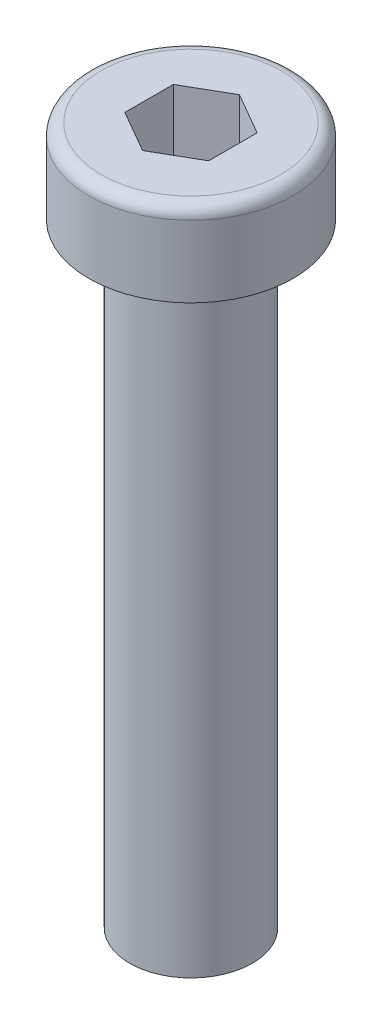
ISO-10303-21;
HEADER;
FILE_DESCRIPTION(('STEP AP214'),'2;1');
FILE_NAME('part.step','',(''),(''),'','','');
FILE_SCHEMA(('AUTOMOTIVE_DESIGN { 1 0 10303 214 1 1 1 1 }'));
ENDSEC;
DATA;
#1=APPLICATION_CONTEXT('core data for automotive mechanical design processes');
#2=APPLICATION_PROTOCOL_DEFINITION('international standard','automotive_design',2000,#1);
#3=PRODUCT_CONTEXT('',#1,'mechanical');
#4=PRODUCT('Part','Part','',(#3));
#5=PRODUCT_RELATED_PRODUCT_CATEGORY('part','',(#4));
#6=PRODUCT_DEFINITION_FORMATION('','',#4);
#7=PRODUCT_DEFINITION_CONTEXT('part definition',#1,'design');
#8=PRODUCT_DEFINITION('design','',#6,#7);
#9=PRODUCT_DEFINITION_SHAPE('','',#8);
#10=(LENGTH_UNIT() NAMED_UNIT(*) SI_UNIT(.MILLI.,.METRE.));
#11=(NAMED_UNIT(*) PLANE_ANGLE_UNIT() SI_UNIT($,.RADIAN.));
#12=(NAMED_UNIT(*) SI_UNIT($,.STERADIAN.) SOLID_ANGLE_UNIT());
#13=UNCERTAINTY_MEASURE_WITH_UNIT(LENGTH_MEASURE(1.E-05),#10,'distance_accuracy_value','');
#14=(GEOMETRIC_REPRESENTATION_CONTEXT(3) GLOBAL_UNCERTAINTY_ASSIGNED_CONTEXT((#13)) GLOBAL_UNIT_ASSIGNED_CONTEXT((#10,
#11,#12)) REPRESENTATION_CONTEXT('',''));
#15=CARTESIAN_POINT('',(0.,0.,0.));
#16=DIRECTION('',(0.,0.,1.));
#17=DIRECTION('',(1.,0.,0.));
#18=AXIS2_PLACEMENT_3D('',#15,#16,#17);
#19=CARTESIAN_POINT('',(0.,4.1,0.));
#20=DIRECTION('',(0.,-1.,0.));
#21=DIRECTION('',(0.,0.,-1.));
#22=AXIS2_PLACEMENT_3D('',#19,#20,#21);
#23=CYLINDRICAL_SURFACE('',#22,5.);
#24=CARTESIAN_POINT('',(0.,3.5,0.));
#25=DIRECTION('',(0.,1.,0.));
#26=DIRECTION('',(0.,0.,1.));
#27=AXIS2_PLACEMENT_3D('',#24,#25,#26);
#28=CIRCLE('',#27,5.);
#29=CARTESIAN_POINT('',(0.,3.5,5.));
#30=VERTEX_POINT('',#29);
#31=EDGE_CURVE('E37',#30,#30,#28,.F.);
#32=ORIENTED_EDGE('',*,*,#31,.T.);
#33=EDGE_LOOP('',(#32));
#34=FACE_BOUND('',#33,.T.);
#35=CARTESIAN_POINT('',(0.,0.,0.));
#36=DIRECTION('',(0.,1.,0.));
#37=DIRECTION('',(0.,0.,1.));
#38=AXIS2_PLACEMENT_3D('',#35,#36,#37);
#39=CIRCLE('',#38,5.);
#40=CARTESIAN_POINT('',(0.,0.,5.));
#41=VERTEX_POINT('',#40);
#42=EDGE_CURVE('E137',#41,#41,#39,.T.);
#43=ORIENTED_EDGE('',*,*,#42,.T.);
#44=EDGE_LOOP('',(#43));
#45=FACE_BOUND('',#44,.T.);
#46=ADVANCED_FACE('F33',(#34,#45),#23,.T.);
#47=CARTESIAN_POINT('',(0.,4.1,0.));
#48=DIRECTION('',(0.,1.,0.));
#49=DIRECTION('',(0.,0.,1.));
#50=AXIS2_PLACEMENT_3D('',#47,#48,#49);
#51=PLANE('',#50);
#52=DIRECTION('',(0.866025403784439,0.,0.5));
#53=VECTOR('',#52,1.);
#54=CARTESIAN_POINT('',(-2.05,4.1,1.18356805183873));
#55=LINE('',#54,#53);
#56=CARTESIAN_POINT('',(-2.05,4.1,1.18356805183873));
#57=VERTEX_POINT('',#56);
#58=CARTESIAN_POINT('',(0.,4.1,2.36713610367747));
#59=VERTEX_POINT('',#58);
#60=EDGE_CURVE('E49',#57,#59,#55,.T.);
#61=ORIENTED_EDGE('',*,*,#60,.F.);
#62=DIRECTION('',(0.,0.,1.));
#63=VECTOR('',#62,1.);
#64=CARTESIAN_POINT('',(-2.05,4.1,-1.18356805183873));
#65=LINE('',#64,#63);
#66=CARTESIAN_POINT('',(-2.05,4.1,-1.18356805183873));
#67=VERTEX_POINT('',#66);
#68=EDGE_CURVE('E133',#67,#57,#65,.T.);
#69=ORIENTED_EDGE('',*,*,#68,.F.);
#70=DIRECTION('',(-0.866025403784438,0.,0.5));
#71=VECTOR('',#70,1.);
#72=CARTESIAN_POINT('',(0.,4.1,-2.36713610367747));
#73=LINE('',#72,#71);
#74=CARTESIAN_POINT('',(0.,4.1,-2.36713610367747));
#75=VERTEX_POINT('',#74);
#76=EDGE_CURVE('E131',#75,#67,#73,.T.);
#77=ORIENTED_EDGE('',*,*,#76,.F.);
#78=DIRECTION('',(-0.866025403784439,0.,-0.5));
#79=VECTOR('',#78,1.);
#80=CARTESIAN_POINT('',(2.05,4.1,-1.18356805183873));
#81=LINE('',#80,#79);
#82=CARTESIAN_POINT('',(2.05,4.1,-1.18356805183873));
#83=VERTEX_POINT('',#82);
#84=EDGE_CURVE('E97',#83,#75,#81,.T.);
#85=ORIENTED_EDGE('',*,*,#84,.F.);
#86=DIRECTION('',(0.,0.,-1.));
#87=VECTOR('',#86,1.);
#88=CARTESIAN_POINT('',(2.05,4.1,1.18356805183873));
#89=LINE('',#88,#87);
#90=CARTESIAN_POINT('',(2.05,4.1,1.18356805183873));
#91=VERTEX_POINT('',#90);
#92=EDGE_CURVE('E127',#91,#83,#89,.T.);
#93=ORIENTED_EDGE('',*,*,#92,.F.);
#94=DIRECTION('',(0.866025403784438,0.,-0.5));
#95=VECTOR('',#94,1.);
#96=CARTESIAN_POINT('',(0.,4.1,2.36713610367747));
#97=LINE('',#96,#95);
#98=EDGE_CURVE('E123',#59,#91,#97,.T.);
#99=ORIENTED_EDGE('',*,*,#98,.F.);
#100=EDGE_LOOP('',(#61,#69,#77,#85,#93,#99));
#101=FACE_BOUND('',#100,.T.);
#102=CARTESIAN_POINT('',(0.,4.1,0.));
#103=DIRECTION('',(0.,1.,0.));
#104=DIRECTION('',(0.,0.,1.));
#105=AXIS2_PLACEMENT_3D('',#102,#103,#104);
#106=CIRCLE('',#105,4.4);
#107=CARTESIAN_POINT('',(0.,4.1,4.4));
#108=VERTEX_POINT('',#107);
#109=EDGE_CURVE('E144',#108,#108,#106,.T.);
#110=ORIENTED_EDGE('',*,*,#109,.T.);
#111=EDGE_LOOP('',(#110));
#112=FACE_BOUND('',#111,.T.);
#113=ADVANCED_FACE('F163',(#101,#112),#51,.T.);
#114=CARTESIAN_POINT('',(0.,0.,0.));
#115=DIRECTION('',(0.,1.,0.));
#116=DIRECTION('',(0.,0.,1.));
#117=AXIS2_PLACEMENT_3D('',#114,#115,#116);
#118=PLANE('',#117);
#119=CARTESIAN_POINT('',(0.,0.,0.));
#120=DIRECTION('',(0.,-1.,0.));
#121=DIRECTION('',(0.,0.,-1.));
#122=AXIS2_PLACEMENT_3D('',#119,#120,#121);
#123=CIRCLE('',#122,3.);
#124=CARTESIAN_POINT('',(0.,0.,-3.));
#125=VERTEX_POINT('',#124);
#126=EDGE_CURVE('E11',#125,#125,#123,.T.);
#127=ORIENTED_EDGE('',*,*,#126,.F.);
#128=EDGE_LOOP('',(#127));
#129=FACE_BOUND('',#128,.T.);
#130=ORIENTED_EDGE('',*,*,#42,.F.);
#131=EDGE_LOOP('',(#130));
#132=FACE_BOUND('',#131,.T.);
#133=ADVANCED_FACE('F156',(#129,#132),#118,.F.);
#134=CARTESIAN_POINT('',(0.,3.5,0.));
#135=DIRECTION('',(0.,1.,0.));
#136=DIRECTION('',(0.,0.,1.));
#137=AXIS2_PLACEMENT_3D('',#134,#135,#136);
#138=TOROIDAL_SURFACE('',#137,4.4,0.6);
#139=ORIENTED_EDGE('',*,*,#31,.F.);
#140=EDGE_LOOP('',(#139));
#141=FACE_BOUND('',#140,.T.);
#142=ORIENTED_EDGE('',*,*,#109,.F.);
#143=EDGE_LOOP('',(#142));
#144=FACE_BOUND('',#143,.T.);
#145=ADVANCED_FACE('F35',(#141,#144),#138,.T.);
#146=CARTESIAN_POINT('',(-2.05,0.5,1.18356805183873));
#147=DIRECTION('',(-0.5,0.,0.866025403784438));
#148=DIRECTION('',(0.866025403784439,0.,0.5));
#149=AXIS2_PLACEMENT_3D('',#146,#147,#148);
#150=PLANE('',#149);
#151=ORIENTED_EDGE('',*,*,#60,.T.);
#152=DIRECTION('',(0.,1.,0.));
#153=VECTOR('',#152,1.);
#154=CARTESIAN_POINT('',(0.,0.5,2.36713610367747));
#155=LINE('',#154,#153);
#156=CARTESIAN_POINT('',(0.,0.5,2.36713610367747));
#157=VERTEX_POINT('',#156);
#158=EDGE_CURVE('E79',#157,#59,#155,.T.);
#159=ORIENTED_EDGE('',*,*,#158,.F.);
#160=DIRECTION('',(0.866025403784439,0.,0.5));
#161=VECTOR('',#160,1.);
#162=CARTESIAN_POINT('',(-2.05,0.5,1.18356805183873));
#163=LINE('',#162,#161);
#164=CARTESIAN_POINT('',(-2.05,0.5,1.18356805183873));
#165=VERTEX_POINT('',#164);
#166=EDGE_CURVE('E135',#165,#157,#163,.T.);
#167=ORIENTED_EDGE('',*,*,#166,.F.);
#168=DIRECTION('',(0.,1.,0.));
#169=VECTOR('',#168,1.);
#170=CARTESIAN_POINT('',(-2.05,0.5,1.18356805183873));
#171=LINE('',#170,#169);
#172=EDGE_CURVE('E57',#165,#57,#171,.T.);
#173=ORIENTED_EDGE('',*,*,#172,.T.);
#174=EDGE_LOOP('',(#151,#159,#167,#173));
#175=FACE_BOUND('',#174,.T.);
#176=ADVANCED_FACE('F155',(#175),#150,.F.);
#177=CARTESIAN_POINT('',(-2.05,0.5,-1.18356805183873));
#178=DIRECTION('',(-1.,0.,0.));
#179=DIRECTION('',(0.,0.,1.));
#180=AXIS2_PLACEMENT_3D('',#177,#178,#179);
#181=PLANE('',#180);
#182=ORIENTED_EDGE('',*,*,#68,.T.);
#183=ORIENTED_EDGE('',*,*,#172,.F.);
#184=DIRECTION('',(0.,0.,1.));
#185=VECTOR('',#184,1.);
#186=CARTESIAN_POINT('',(-2.05,0.5,-1.18356805183873));
#187=LINE('',#186,#185);
#188=CARTESIAN_POINT('',(-2.05,0.5,-1.18356805183873));
#189=VERTEX_POINT('',#188);
#190=EDGE_CURVE('E109',#189,#165,#187,.T.);
#191=ORIENTED_EDGE('',*,*,#190,.F.);
#192=DIRECTION('',(0.,1.,0.));
#193=VECTOR('',#192,1.);
#194=CARTESIAN_POINT('',(-2.05,0.5,-1.18356805183873));
#195=LINE('',#194,#193);
#196=EDGE_CURVE('E101',#189,#67,#195,.T.);
#197=ORIENTED_EDGE('',*,*,#196,.T.);
#198=EDGE_LOOP('',(#182,#183,#191,#197));
#199=FACE_BOUND('',#198,.T.);
#200=ADVANCED_FACE('F161',(#199),#181,.F.);
#201=CARTESIAN_POINT('',(0.,0.5,-2.36713610367747));
#202=DIRECTION('',(-0.5,0.,-0.866025403784439));
#203=DIRECTION('',(-0.866025403784439,0.,0.5));
#204=AXIS2_PLACEMENT_3D('',#201,#202,#203);
#205=PLANE('',#204);
#206=ORIENTED_EDGE('',*,*,#76,.T.);
#207=ORIENTED_EDGE('',*,*,#196,.F.);
#208=DIRECTION('',(-0.866025403784438,0.,0.5));
#209=VECTOR('',#208,1.);
#210=CARTESIAN_POINT('',(0.,0.5,-2.36713610367747));
#211=LINE('',#210,#209);
#212=CARTESIAN_POINT('',(0.,0.5,-2.36713610367747));
#213=VERTEX_POINT('',#212);
#214=EDGE_CURVE('E105',#213,#189,#211,.T.);
#215=ORIENTED_EDGE('',*,*,#214,.F.);
#216=DIRECTION('',(0.,1.,0.));
#217=VECTOR('',#216,1.);
#218=CARTESIAN_POINT('',(0.,0.5,-2.36713610367747));
#219=LINE('',#218,#217);
#220=EDGE_CURVE('E90',#213,#75,#219,.T.);
#221=ORIENTED_EDGE('',*,*,#220,.T.);
#222=EDGE_LOOP('',(#206,#207,#215,#221));
#223=FACE_BOUND('',#222,.T.);
#224=ADVANCED_FACE('F106',(#223),#205,.F.);
#225=CARTESIAN_POINT('',(2.05,0.5,-1.18356805183873));
#226=DIRECTION('',(0.5,0.,-0.866025403784439));
#227=DIRECTION('',(-0.866025403784439,0.,-0.5));
#228=AXIS2_PLACEMENT_3D('',#225,#226,#227);
#229=PLANE('',#228);
#230=ORIENTED_EDGE('',*,*,#84,.T.);
#231=ORIENTED_EDGE('',*,*,#220,.F.);
#232=DIRECTION('',(-0.866025403784439,0.,-0.5));
#233=VECTOR('',#232,1.);
#234=CARTESIAN_POINT('',(2.05,0.5,-1.18356805183873));
#235=LINE('',#234,#233);
#236=CARTESIAN_POINT('',(2.05,0.5,-1.18356805183873));
#237=VERTEX_POINT('',#236);
#238=EDGE_CURVE('E94',#237,#213,#235,.T.);
#239=ORIENTED_EDGE('',*,*,#238,.F.);
#240=DIRECTION('',(0.,1.,0.));
#241=VECTOR('',#240,1.);
#242=CARTESIAN_POINT('',(2.05,0.5,-1.18356805183873));
#243=LINE('',#242,#241);
#244=EDGE_CURVE('E102',#237,#83,#243,.T.);
#245=ORIENTED_EDGE('',*,*,#244,.T.);
#246=EDGE_LOOP('',(#230,#231,#239,#245));
#247=FACE_BOUND('',#246,.T.);
#248=ADVANCED_FACE('F92',(#247),#229,.F.);
#249=CARTESIAN_POINT('',(2.05,0.5,1.18356805183873));
#250=DIRECTION('',(1.,0.,0.));
#251=DIRECTION('',(0.,0.,-1.));
#252=AXIS2_PLACEMENT_3D('',#249,#250,#251);
#253=PLANE('',#252);
#254=ORIENTED_EDGE('',*,*,#92,.T.);
#255=ORIENTED_EDGE('',*,*,#244,.F.);
#256=DIRECTION('',(0.,0.,-1.));
#257=VECTOR('',#256,1.);
#258=CARTESIAN_POINT('',(2.05,0.5,1.18356805183873));
#259=LINE('',#258,#257);
#260=CARTESIAN_POINT('',(2.05,0.5,1.18356805183873));
#261=VERTEX_POINT('',#260);
#262=EDGE_CURVE('E115',#261,#237,#259,.T.);
#263=ORIENTED_EDGE('',*,*,#262,.F.);
#264=DIRECTION('',(0.,1.,0.));
#265=VECTOR('',#264,1.);
#266=CARTESIAN_POINT('',(2.05,0.5,1.18356805183873));
#267=LINE('',#266,#265);
#268=EDGE_CURVE('E140',#261,#91,#267,.T.);
#269=ORIENTED_EDGE('',*,*,#268,.T.);
#270=EDGE_LOOP('',(#254,#255,#263,#269));
#271=FACE_BOUND('',#270,.T.);
#272=ADVANCED_FACE('F176',(#271),#253,.F.);
#273=CARTESIAN_POINT('',(0.,0.5,2.36713610367747));
#274=DIRECTION('',(0.5,0.,0.866025403784439));
#275=DIRECTION('',(0.866025403784439,0.,-0.5));
#276=AXIS2_PLACEMENT_3D('',#273,#274,#275);
#277=PLANE('',#276);
#278=ORIENTED_EDGE('',*,*,#98,.T.);
#279=ORIENTED_EDGE('',*,*,#268,.F.);
#280=DIRECTION('',(0.866025403784438,0.,-0.5));
#281=VECTOR('',#280,1.);
#282=CARTESIAN_POINT('',(0.,0.5,2.36713610367747));
#283=LINE('',#282,#281);
#284=EDGE_CURVE('E117',#157,#261,#283,.T.);
#285=ORIENTED_EDGE('',*,*,#284,.F.);
#286=ORIENTED_EDGE('',*,*,#158,.T.);
#287=EDGE_LOOP('',(#278,#279,#285,#286));
#288=FACE_BOUND('',#287,.T.);
#289=ADVANCED_FACE('F173',(#288),#277,.F.);
#290=CARTESIAN_POINT('',(0.,0.5,0.));
#291=DIRECTION('',(0.,1.,0.));
#292=DIRECTION('',(0.,0.,1.));
#293=AXIS2_PLACEMENT_3D('',#290,#291,#292);
#294=PLANE('',#293);
#295=ORIENTED_EDGE('',*,*,#166,.T.);
#296=ORIENTED_EDGE('',*,*,#284,.T.);
#297=ORIENTED_EDGE('',*,*,#262,.T.);
#298=ORIENTED_EDGE('',*,*,#238,.T.);
#299=ORIENTED_EDGE('',*,*,#214,.T.);
#300=ORIENTED_EDGE('',*,*,#190,.T.);
#301=EDGE_LOOP('',(#295,#296,#297,#298,#299,#300));
#302=FACE_BOUND('',#301,.T.);
#303=ADVANCED_FACE('F112',(#302),#294,.T.);
#304=CARTESIAN_POINT('',(0.,-30.,0.));
#305=DIRECTION('',(0.,1.,0.));
#306=DIRECTION('',(0.,0.,1.));
#307=AXIS2_PLACEMENT_3D('',#304,#305,#306);
#308=CYLINDRICAL_SURFACE('',#307,3.);
#309=CARTESIAN_POINT('',(0.,-30.,0.));
#310=DIRECTION('',(0.,-1.,0.));
#311=DIRECTION('',(0.,0.,-1.));
#312=AXIS2_PLACEMENT_3D('',#309,#310,#311);
#313=CIRCLE('',#312,3.);
#314=CARTESIAN_POINT('',(0.,-30.,-3.));
#315=VERTEX_POINT('',#314);
#316=EDGE_CURVE('E124',#315,#315,#313,.T.);
#317=ORIENTED_EDGE('',*,*,#316,.F.);
#318=EDGE_LOOP('',(#317));
#319=FACE_BOUND('',#318,.T.);
#320=ORIENTED_EDGE('',*,*,#126,.T.);
#321=EDGE_LOOP('',(#320));
#322=FACE_BOUND('',#321,.T.);
#323=ADVANCED_FACE('F189',(#319,#322),#308,.T.);
#324=CARTESIAN_POINT('',(0.,-30.,0.));
#325=DIRECTION('',(0.,-1.,0.));
#326=DIRECTION('',(0.,0.,-1.));
#327=AXIS2_PLACEMENT_3D('',#324,#325,#326);
#328=PLANE('',#327);
#329=ORIENTED_EDGE('',*,*,#316,.T.);
#330=EDGE_LOOP('',(#329));
#331=FACE_BOUND('',#330,.T.);
#332=ADVANCED_FACE('F192',(#331),#328,.T.);
#333=CLOSED_SHELL('',(#46,#113,#133,#145,#176,#200,#224,#248,#272,#289,#303,#323,#332));
#334=MANIFOLD_SOLID_BREP('B2',#333);
#335=ADVANCED_BREP_SHAPE_REPRESENTATION('',(#18,#334),#14);
#336=SHAPE_DEFINITION_REPRESENTATION(#9,#335);
ENDSEC;
END-ISO-10303-21;
